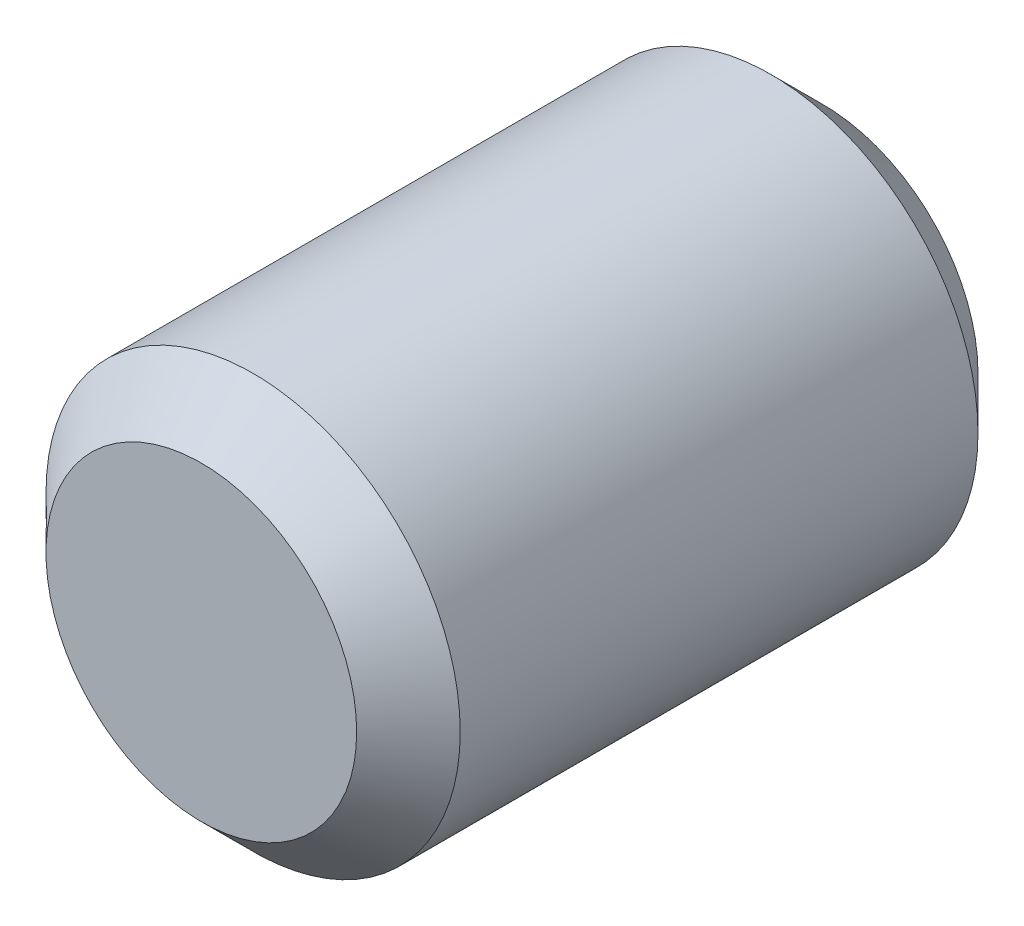
ISO-10303-21;
HEADER;
FILE_DESCRIPTION(('STEP AP214'),'2;1');
FILE_NAME('part.step','',(''),(''),'','','');
FILE_SCHEMA(('AUTOMOTIVE_DESIGN { 1 0 10303 214 1 1 1 1 }'));
ENDSEC;
DATA;
#1=APPLICATION_CONTEXT('core data for automotive mechanical design processes');
#2=APPLICATION_PROTOCOL_DEFINITION('international standard','automotive_design',2000,#1);
#3=PRODUCT_CONTEXT('',#1,'mechanical');
#4=PRODUCT('Part','Part','',(#3));
#5=PRODUCT_RELATED_PRODUCT_CATEGORY('part','',(#4));
#6=PRODUCT_DEFINITION_FORMATION('','',#4);
#7=PRODUCT_DEFINITION_CONTEXT('part definition',#1,'design');
#8=PRODUCT_DEFINITION('design','',#6,#7);
#9=PRODUCT_DEFINITION_SHAPE('','',#8);
#10=(LENGTH_UNIT() NAMED_UNIT(*) SI_UNIT(.MILLI.,.METRE.));
#11=(NAMED_UNIT(*) PLANE_ANGLE_UNIT() SI_UNIT($,.RADIAN.));
#12=(NAMED_UNIT(*) SI_UNIT($,.STERADIAN.) SOLID_ANGLE_UNIT());
#13=UNCERTAINTY_MEASURE_WITH_UNIT(LENGTH_MEASURE(1.E-05),#10,'distance_accuracy_value','');
#14=(GEOMETRIC_REPRESENTATION_CONTEXT(3) GLOBAL_UNCERTAINTY_ASSIGNED_CONTEXT((#13)) GLOBAL_UNIT_ASSIGNED_CONTEXT((#10,
#11,#12)) REPRESENTATION_CONTEXT('',''));
#15=CARTESIAN_POINT('',(0.,0.,0.));
#16=DIRECTION('',(0.,0.,1.));
#17=DIRECTION('',(1.,0.,0.));
#18=AXIS2_PLACEMENT_3D('',#15,#16,#17);
#19=CARTESIAN_POINT('',(0.,0.,3.));
#20=DIRECTION('',(0.,0.,-1.));
#21=DIRECTION('',(-1.,0.,0.));
#22=AXIS2_PLACEMENT_3D('',#19,#20,#21);
#23=CYLINDRICAL_SURFACE('',#22,2.);
#24=CARTESIAN_POINT('',(0.,0.,-2.5));
#25=DIRECTION('',(0.,0.,1.));
#26=DIRECTION('',(1.,0.,0.));
#27=AXIS2_PLACEMENT_3D('',#24,#25,#26);
#28=CIRCLE('',#27,2.);
#29=CARTESIAN_POINT('',(2.,0.,-2.5));
#30=VERTEX_POINT('',#29);
#31=EDGE_CURVE('E57',#30,#30,#28,.T.);
#32=ORIENTED_EDGE('',*,*,#31,.T.);
#33=EDGE_LOOP('',(#32));
#34=FACE_BOUND('',#33,.T.);
#35=CARTESIAN_POINT('',(0.,0.,2.5));
#36=DIRECTION('',(0.,0.,1.));
#37=DIRECTION('',(1.,0.,0.));
#38=AXIS2_PLACEMENT_3D('',#35,#36,#37);
#39=CIRCLE('',#38,2.);
#40=CARTESIAN_POINT('',(2.,0.,2.5));
#41=VERTEX_POINT('',#40);
#42=EDGE_CURVE('E62',#41,#41,#39,.F.);
#43=ORIENTED_EDGE('',*,*,#42,.T.);
#44=EDGE_LOOP('',(#43));
#45=FACE_BOUND('',#44,.T.);
#46=ADVANCED_FACE('F43',(#34,#45),#23,.T.);
#47=CARTESIAN_POINT('',(0.,0.,3.));
#48=DIRECTION('',(0.,0.,1.));
#49=DIRECTION('',(1.,0.,0.));
#50=AXIS2_PLACEMENT_3D('',#47,#48,#49);
#51=PLANE('',#50);
#52=CARTESIAN_POINT('',(0.,0.,3.));
#53=DIRECTION('',(0.,0.,1.));
#54=DIRECTION('',(1.,0.,0.));
#55=AXIS2_PLACEMENT_3D('',#52,#53,#54);
#56=CIRCLE('',#55,1.5);
#57=CARTESIAN_POINT('',(1.5,0.,3.));
#58=VERTEX_POINT('',#57);
#59=EDGE_CURVE('E10',#58,#58,#56,.T.);
#60=ORIENTED_EDGE('',*,*,#59,.T.);
#61=EDGE_LOOP('',(#60));
#62=FACE_BOUND('',#61,.T.);
#63=ADVANCED_FACE('F79',(#62),#51,.T.);
#64=CARTESIAN_POINT('',(0.,0.,-3.));
#65=DIRECTION('',(0.,0.,1.));
#66=DIRECTION('',(1.,0.,0.));
#67=AXIS2_PLACEMENT_3D('',#64,#65,#66);
#68=PLANE('',#67);
#69=CARTESIAN_POINT('',(0.,0.,-3.));
#70=DIRECTION('',(0.,0.,1.));
#71=DIRECTION('',(1.,0.,0.));
#72=AXIS2_PLACEMENT_3D('',#69,#70,#71);
#73=CIRCLE('',#72,1.5);
#74=CARTESIAN_POINT('',(1.5,0.,-3.));
#75=VERTEX_POINT('',#74);
#76=EDGE_CURVE('E52',#75,#75,#73,.F.);
#77=ORIENTED_EDGE('',*,*,#76,.T.);
#78=EDGE_LOOP('',(#77));
#79=FACE_BOUND('',#78,.T.);
#80=ADVANCED_FACE('F76',(#79),#68,.F.);
#81=CARTESIAN_POINT('',(0.,0.,-2.5));
#82=DIRECTION('',(0.,0.,1.));
#83=DIRECTION('',(1.,0.,0.));
#84=AXIS2_PLACEMENT_3D('',#81,#82,#83);
#85=CONICAL_SURFACE('',#84,2.,0.78539816339745);
#86=ORIENTED_EDGE('',*,*,#76,.F.);
#87=EDGE_LOOP('',(#86));
#88=FACE_BOUND('',#87,.T.);
#89=ORIENTED_EDGE('',*,*,#31,.F.);
#90=EDGE_LOOP('',(#89));
#91=FACE_BOUND('',#90,.T.);
#92=ADVANCED_FACE('F72',(#88,#91),#85,.T.);
#93=CARTESIAN_POINT('',(0.,0.,3.));
#94=DIRECTION('',(0.,0.,-1.));
#95=DIRECTION('',(-1.,0.,0.));
#96=AXIS2_PLACEMENT_3D('',#93,#94,#95);
#97=CONICAL_SURFACE('',#96,1.5,0.785398163397447);
#98=ORIENTED_EDGE('',*,*,#42,.F.);
#99=EDGE_LOOP('',(#98));
#100=FACE_BOUND('',#99,.T.);
#101=ORIENTED_EDGE('',*,*,#59,.F.);
#102=EDGE_LOOP('',(#101));
#103=FACE_BOUND('',#102,.T.);
#104=ADVANCED_FACE('F46',(#100,#103),#97,.T.);
#105=CLOSED_SHELL('',(#46,#63,#80,#92,#104));
#106=MANIFOLD_SOLID_BREP('B2',#105);
#107=ADVANCED_BREP_SHAPE_REPRESENTATION('',(#18,#106),#14);
#108=SHAPE_DEFINITION_REPRESENTATION(#9,#107);
ENDSEC;
END-ISO-10303-21;
